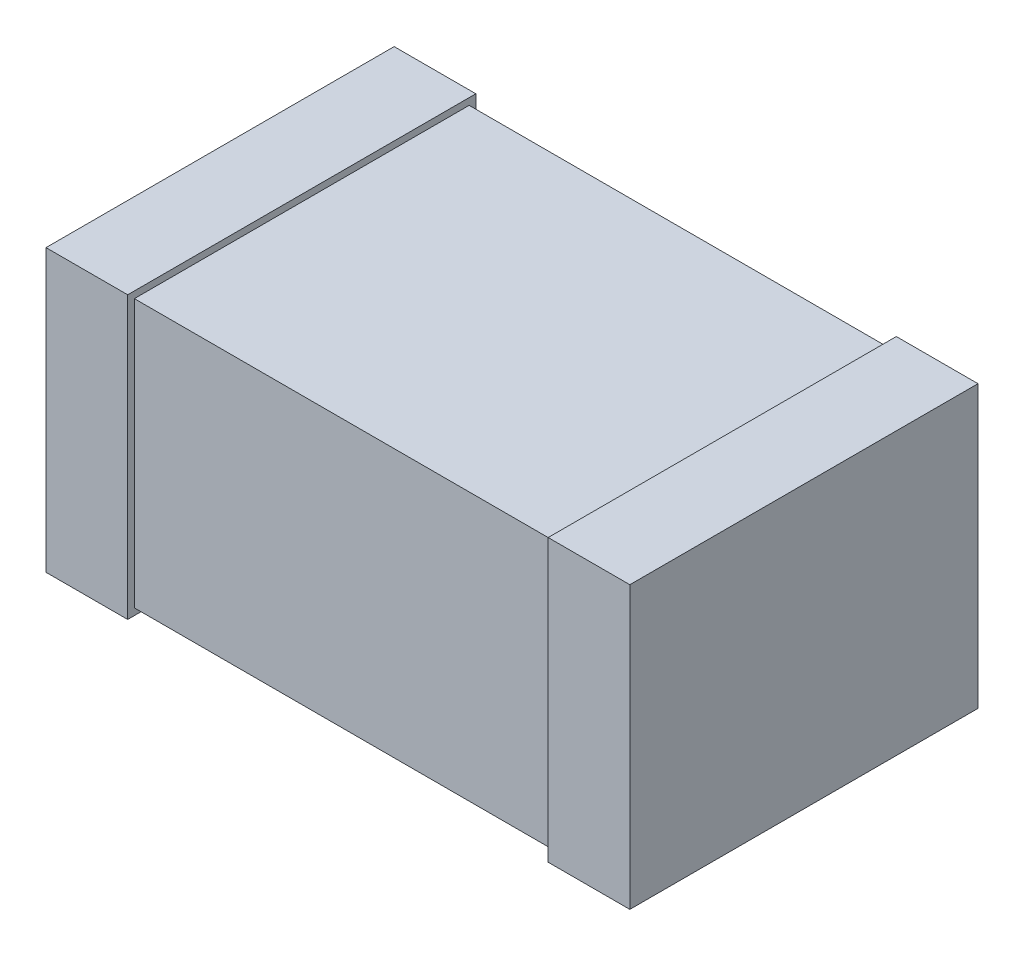
ISO-10303-21;
HEADER;
FILE_DESCRIPTION(('STEP AP214'),'2;1');
FILE_NAME('part.step','',(''),(''),'','','');
FILE_SCHEMA(('AUTOMOTIVE_DESIGN { 1 0 10303 214 1 1 1 1 }'));
ENDSEC;
DATA;
#1=APPLICATION_CONTEXT('core data for automotive mechanical design processes');
#2=APPLICATION_PROTOCOL_DEFINITION('international standard','automotive_design',2000,#1);
#3=PRODUCT_CONTEXT('',#1,'mechanical');
#4=PRODUCT('Part','Part','',(#3));
#5=PRODUCT_RELATED_PRODUCT_CATEGORY('part','',(#4));
#6=PRODUCT_DEFINITION_FORMATION('','',#4);
#7=PRODUCT_DEFINITION_CONTEXT('part definition',#1,'design');
#8=PRODUCT_DEFINITION('design','',#6,#7);
#9=PRODUCT_DEFINITION_SHAPE('','',#8);
#10=(LENGTH_UNIT() NAMED_UNIT(*) SI_UNIT(.MILLI.,.METRE.));
#11=(NAMED_UNIT(*) PLANE_ANGLE_UNIT() SI_UNIT($,.RADIAN.));
#12=(NAMED_UNIT(*) SI_UNIT($,.STERADIAN.) SOLID_ANGLE_UNIT());
#13=UNCERTAINTY_MEASURE_WITH_UNIT(LENGTH_MEASURE(1.E-05),#10,'distance_accuracy_value','');
#14=(GEOMETRIC_REPRESENTATION_CONTEXT(3) GLOBAL_UNCERTAINTY_ASSIGNED_CONTEXT((#13)) GLOBAL_UNIT_ASSIGNED_CONTEXT((#10,
#11,#12)) REPRESENTATION_CONTEXT('',''));
#15=CARTESIAN_POINT('',(0.,0.,0.));
#16=DIRECTION('',(0.,0.,1.));
#17=DIRECTION('',(1.,0.,0.));
#18=AXIS2_PLACEMENT_3D('',#15,#16,#17);
#19=CARTESIAN_POINT('',(-1.6,2.,1.25));
#20=DIRECTION('',(0.,0.,-1.));
#21=DIRECTION('',(-1.,0.,0.));
#22=AXIS2_PLACEMENT_3D('',#19,#20,#21);
#23=PLANE('',#22);
#24=DIRECTION('',(0.,1.,0.));
#25=VECTOR('',#24,1.);
#26=CARTESIAN_POINT('',(-1.57,2.,1.25));
#27=LINE('',#26,#25);
#28=CARTESIAN_POINT('',(-1.57,0.,1.25));
#29=VERTEX_POINT('',#28);
#30=CARTESIAN_POINT('',(-1.57,2.,1.25));
#31=VERTEX_POINT('',#30);
#32=EDGE_CURVE('E171',#29,#31,#27,.T.);
#33=ORIENTED_EDGE('',*,*,#32,.F.);
#34=DIRECTION('',(1.,0.,0.));
#35=VECTOR('',#34,1.);
#36=CARTESIAN_POINT('',(-1.6,0.,1.25));
#37=LINE('',#36,#35);
#38=CARTESIAN_POINT('',(1.57,0.,1.25));
#39=VERTEX_POINT('',#38);
#40=EDGE_CURVE('E215',#29,#39,#37,.T.);
#41=ORIENTED_EDGE('',*,*,#40,.T.);
#42=DIRECTION('',(0.,-1.,0.));
#43=VECTOR('',#42,1.);
#44=CARTESIAN_POINT('',(1.57,2.,1.25));
#45=LINE('',#44,#43);
#46=CARTESIAN_POINT('',(1.57,2.,1.25));
#47=VERTEX_POINT('',#46);
#48=EDGE_CURVE('E210',#47,#39,#45,.T.);
#49=ORIENTED_EDGE('',*,*,#48,.F.);
#50=DIRECTION('',(1.,0.,0.));
#51=VECTOR('',#50,1.);
#52=CARTESIAN_POINT('',(-1.6,2.,1.25));
#53=LINE('',#52,#51);
#54=EDGE_CURVE('E216',#31,#47,#53,.T.);
#55=ORIENTED_EDGE('',*,*,#54,.F.);
#56=EDGE_LOOP('',(#33,#41,#49,#55));
#57=FACE_BOUND('',#56,.T.);
#58=ADVANCED_FACE('F38',(#57),#23,.F.);
#59=CARTESIAN_POINT('',(-1.6,2.,-1.25));
#60=DIRECTION('',(0.,0.,1.));
#61=DIRECTION('',(1.,0.,0.));
#62=AXIS2_PLACEMENT_3D('',#59,#60,#61);
#63=PLANE('',#62);
#64=DIRECTION('',(0.,-1.,0.));
#65=VECTOR('',#64,1.);
#66=CARTESIAN_POINT('',(-1.57,2.,-1.25));
#67=LINE('',#66,#65);
#68=CARTESIAN_POINT('',(-1.57,2.,-1.25));
#69=VERTEX_POINT('',#68);
#70=CARTESIAN_POINT('',(-1.57,0.,-1.25));
#71=VERTEX_POINT('',#70);
#72=EDGE_CURVE('E52',#69,#71,#67,.T.);
#73=ORIENTED_EDGE('',*,*,#72,.F.);
#74=DIRECTION('',(-1.,0.,0.));
#75=VECTOR('',#74,1.);
#76=CARTESIAN_POINT('',(-1.6,2.,-1.25));
#77=LINE('',#76,#75);
#78=CARTESIAN_POINT('',(1.57,2.,-1.25));
#79=VERTEX_POINT('',#78);
#80=EDGE_CURVE('E218',#79,#69,#77,.T.);
#81=ORIENTED_EDGE('',*,*,#80,.F.);
#82=DIRECTION('',(0.,1.,0.));
#83=VECTOR('',#82,1.);
#84=CARTESIAN_POINT('',(1.57,2.,-1.25));
#85=LINE('',#84,#83);
#86=CARTESIAN_POINT('',(1.57,0.,-1.25));
#87=VERTEX_POINT('',#86);
#88=EDGE_CURVE('E202',#87,#79,#85,.T.);
#89=ORIENTED_EDGE('',*,*,#88,.F.);
#90=DIRECTION('',(-1.,0.,0.));
#91=VECTOR('',#90,1.);
#92=CARTESIAN_POINT('',(-1.6,0.,-1.25));
#93=LINE('',#92,#91);
#94=EDGE_CURVE('E219',#87,#71,#93,.T.);
#95=ORIENTED_EDGE('',*,*,#94,.T.);
#96=EDGE_LOOP('',(#73,#81,#89,#95));
#97=FACE_BOUND('',#96,.T.);
#98=ADVANCED_FACE('F233',(#97),#63,.F.);
#99=CARTESIAN_POINT('',(0.,2.,0.));
#100=DIRECTION('',(0.,1.,0.));
#101=DIRECTION('',(0.,0.,1.));
#102=AXIS2_PLACEMENT_3D('',#99,#100,#101);
#103=PLANE('',#102);
#104=ORIENTED_EDGE('',*,*,#80,.T.);
#105=DIRECTION('',(0.,0.,1.));
#106=VECTOR('',#105,1.);
#107=CARTESIAN_POINT('',(-1.57,2.,0.));
#108=LINE('',#107,#106);
#109=EDGE_CURVE('E59',#69,#31,#108,.T.);
#110=ORIENTED_EDGE('',*,*,#109,.T.);
#111=ORIENTED_EDGE('',*,*,#54,.T.);
#112=DIRECTION('',(0.,0.,-1.));
#113=VECTOR('',#112,1.);
#114=CARTESIAN_POINT('',(1.57,2.,0.));
#115=LINE('',#114,#113);
#116=EDGE_CURVE('E213',#47,#79,#115,.T.);
#117=ORIENTED_EDGE('',*,*,#116,.T.);
#118=EDGE_LOOP('',(#104,#110,#111,#117));
#119=FACE_BOUND('',#118,.T.);
#120=ADVANCED_FACE('F234',(#119),#103,.T.);
#121=CARTESIAN_POINT('',(0.,0.,0.));
#122=DIRECTION('',(0.,1.,0.));
#123=DIRECTION('',(0.,0.,1.));
#124=AXIS2_PLACEMENT_3D('',#121,#122,#123);
#125=PLANE('',#124);
#126=DIRECTION('',(0.,0.,1.));
#127=VECTOR('',#126,1.);
#128=CARTESIAN_POINT('',(-1.57,0.,0.));
#129=LINE('',#128,#127);
#130=EDGE_CURVE('E11',#71,#29,#129,.T.);
#131=ORIENTED_EDGE('',*,*,#130,.F.);
#132=ORIENTED_EDGE('',*,*,#94,.F.);
#133=DIRECTION('',(0.,0.,-1.));
#134=VECTOR('',#133,1.);
#135=CARTESIAN_POINT('',(1.57,0.,0.));
#136=LINE('',#135,#134);
#137=EDGE_CURVE('E45',#39,#87,#136,.T.);
#138=ORIENTED_EDGE('',*,*,#137,.F.);
#139=ORIENTED_EDGE('',*,*,#40,.F.);
#140=EDGE_LOOP('',(#131,#132,#138,#139));
#141=FACE_BOUND('',#140,.T.);
#142=ADVANCED_FACE('F231',(#141),#125,.F.);
#143=CARTESIAN_POINT('',(1.57,2.05,1.3));
#144=DIRECTION('',(0.,0.,1.));
#145=DIRECTION('',(1.,0.,0.));
#146=AXIS2_PLACEMENT_3D('',#143,#144,#145);
#147=PLANE('',#146);
#148=DIRECTION('',(1.,0.,0.));
#149=VECTOR('',#148,1.);
#150=CARTESIAN_POINT('',(1.57,-0.0500000000000118,1.3));
#151=LINE('',#150,#149);
#152=CARTESIAN_POINT('',(1.57,-0.0500000000000118,1.3));
#153=VERTEX_POINT('',#152);
#154=CARTESIAN_POINT('',(2.18,-0.0500000000000118,1.3));
#155=VERTEX_POINT('',#154);
#156=EDGE_CURVE('E199',#153,#155,#151,.T.);
#157=ORIENTED_EDGE('',*,*,#156,.T.);
#158=DIRECTION('',(0.,-1.,0.));
#159=VECTOR('',#158,1.);
#160=CARTESIAN_POINT('',(2.18,2.04999999999999,1.3));
#161=LINE('',#160,#159);
#162=CARTESIAN_POINT('',(2.18,2.04999999999999,1.3));
#163=VERTEX_POINT('',#162);
#164=EDGE_CURVE('E175',#163,#155,#161,.T.);
#165=ORIENTED_EDGE('',*,*,#164,.F.);
#166=DIRECTION('',(1.,0.,0.));
#167=VECTOR('',#166,1.);
#168=CARTESIAN_POINT('',(1.57,2.05,1.3));
#169=LINE('',#168,#167);
#170=CARTESIAN_POINT('',(1.57,2.05,1.3));
#171=VERTEX_POINT('',#170);
#172=EDGE_CURVE('E200',#171,#163,#169,.T.);
#173=ORIENTED_EDGE('',*,*,#172,.F.);
#174=DIRECTION('',(0.,-1.,0.));
#175=VECTOR('',#174,1.);
#176=CARTESIAN_POINT('',(1.57,2.05,1.3));
#177=LINE('',#176,#175);
#178=EDGE_CURVE('E187',#171,#153,#177,.T.);
#179=ORIENTED_EDGE('',*,*,#178,.T.);
#180=EDGE_LOOP('',(#157,#165,#173,#179));
#181=FACE_BOUND('',#180,.T.);
#182=ADVANCED_FACE('F249',(#181),#147,.T.);
#183=CARTESIAN_POINT('',(1.57,2.05,-1.3));
#184=DIRECTION('',(0.,1.,0.));
#185=DIRECTION('',(0.,0.,1.));
#186=AXIS2_PLACEMENT_3D('',#183,#184,#185);
#187=PLANE('',#186);
#188=ORIENTED_EDGE('',*,*,#172,.T.);
#189=DIRECTION('',(0.,0.,1.));
#190=VECTOR('',#189,1.);
#191=CARTESIAN_POINT('',(2.18,2.04999999999999,-1.3));
#192=LINE('',#191,#190);
#193=CARTESIAN_POINT('',(2.18,2.04999999999999,-1.3));
#194=VERTEX_POINT('',#193);
#195=EDGE_CURVE('E184',#194,#163,#192,.T.);
#196=ORIENTED_EDGE('',*,*,#195,.F.);
#197=DIRECTION('',(1.,0.,0.));
#198=VECTOR('',#197,1.);
#199=CARTESIAN_POINT('',(1.57,2.05,-1.3));
#200=LINE('',#199,#198);
#201=CARTESIAN_POINT('',(1.57,2.05,-1.3));
#202=VERTEX_POINT('',#201);
#203=EDGE_CURVE('E203',#202,#194,#200,.T.);
#204=ORIENTED_EDGE('',*,*,#203,.F.);
#205=DIRECTION('',(0.,0.,1.));
#206=VECTOR('',#205,1.);
#207=CARTESIAN_POINT('',(1.57,2.05,-1.3));
#208=LINE('',#207,#206);
#209=EDGE_CURVE('E196',#202,#171,#208,.T.);
#210=ORIENTED_EDGE('',*,*,#209,.T.);
#211=EDGE_LOOP('',(#188,#196,#204,#210));
#212=FACE_BOUND('',#211,.T.);
#213=ADVANCED_FACE('F253',(#212),#187,.T.);
#214=CARTESIAN_POINT('',(1.57,-0.0500000000000118,-1.3));
#215=DIRECTION('',(0.,0.,-1.));
#216=DIRECTION('',(-1.,0.,0.));
#217=AXIS2_PLACEMENT_3D('',#214,#215,#216);
#218=PLANE('',#217);
#219=ORIENTED_EDGE('',*,*,#203,.T.);
#220=DIRECTION('',(0.,1.,0.));
#221=VECTOR('',#220,1.);
#222=CARTESIAN_POINT('',(2.18,-0.0500000000000118,-1.3));
#223=LINE('',#222,#221);
#224=CARTESIAN_POINT('',(2.18,-0.0500000000000118,-1.3));
#225=VERTEX_POINT('',#224);
#226=EDGE_CURVE('E181',#225,#194,#223,.T.);
#227=ORIENTED_EDGE('',*,*,#226,.F.);
#228=DIRECTION('',(1.,0.,0.));
#229=VECTOR('',#228,1.);
#230=CARTESIAN_POINT('',(1.57,-0.0500000000000118,-1.3));
#231=LINE('',#230,#229);
#232=CARTESIAN_POINT('',(1.57,-0.0500000000000118,-1.3));
#233=VERTEX_POINT('',#232);
#234=EDGE_CURVE('E205',#233,#225,#231,.T.);
#235=ORIENTED_EDGE('',*,*,#234,.F.);
#236=DIRECTION('',(0.,1.,0.));
#237=VECTOR('',#236,1.);
#238=CARTESIAN_POINT('',(1.57,-0.0500000000000118,-1.3));
#239=LINE('',#238,#237);
#240=EDGE_CURVE('E193',#233,#202,#239,.T.);
#241=ORIENTED_EDGE('',*,*,#240,.T.);
#242=EDGE_LOOP('',(#219,#227,#235,#241));
#243=FACE_BOUND('',#242,.T.);
#244=ADVANCED_FACE('F258',(#243),#218,.T.);
#245=CARTESIAN_POINT('',(1.57,-0.0500000000000118,1.3));
#246=DIRECTION('',(0.,-1.,0.));
#247=DIRECTION('',(0.,0.,-1.));
#248=AXIS2_PLACEMENT_3D('',#245,#246,#247);
#249=PLANE('',#248);
#250=ORIENTED_EDGE('',*,*,#234,.T.);
#251=DIRECTION('',(0.,0.,-1.));
#252=VECTOR('',#251,1.);
#253=CARTESIAN_POINT('',(2.18,-0.0500000000000118,1.3));
#254=LINE('',#253,#252);
#255=EDGE_CURVE('E178',#155,#225,#254,.T.);
#256=ORIENTED_EDGE('',*,*,#255,.F.);
#257=ORIENTED_EDGE('',*,*,#156,.F.);
#258=DIRECTION('',(0.,0.,-1.));
#259=VECTOR('',#258,1.);
#260=CARTESIAN_POINT('',(1.57,-0.0500000000000118,1.3));
#261=LINE('',#260,#259);
#262=EDGE_CURVE('E190',#153,#233,#261,.T.);
#263=ORIENTED_EDGE('',*,*,#262,.T.);
#264=EDGE_LOOP('',(#250,#256,#257,#263));
#265=FACE_BOUND('',#264,.T.);
#266=ADVANCED_FACE('F255',(#265),#249,.T.);
#267=CARTESIAN_POINT('',(1.57,0.,0.));
#268=DIRECTION('',(1.,0.,0.));
#269=DIRECTION('',(0.,0.,-1.));
#270=AXIS2_PLACEMENT_3D('',#267,#268,#269);
#271=PLANE('',#270);
#272=ORIENTED_EDGE('',*,*,#116,.F.);
#273=ORIENTED_EDGE('',*,*,#48,.T.);
#274=ORIENTED_EDGE('',*,*,#137,.T.);
#275=ORIENTED_EDGE('',*,*,#88,.T.);
#276=EDGE_LOOP('',(#272,#273,#274,#275));
#277=FACE_BOUND('',#276,.T.);
#278=ORIENTED_EDGE('',*,*,#178,.F.);
#279=ORIENTED_EDGE('',*,*,#209,.F.);
#280=ORIENTED_EDGE('',*,*,#240,.F.);
#281=ORIENTED_EDGE('',*,*,#262,.F.);
#282=EDGE_LOOP('',(#278,#279,#280,#281));
#283=FACE_BOUND('',#282,.T.);
#284=ADVANCED_FACE('F226',(#277,#283),#271,.F.);
#285=CARTESIAN_POINT('',(2.18,0.,0.));
#286=DIRECTION('',(1.,0.,0.));
#287=DIRECTION('',(0.,0.,-1.));
#288=AXIS2_PLACEMENT_3D('',#285,#286,#287);
#289=PLANE('',#288);
#290=ORIENTED_EDGE('',*,*,#164,.T.);
#291=ORIENTED_EDGE('',*,*,#255,.T.);
#292=ORIENTED_EDGE('',*,*,#226,.T.);
#293=ORIENTED_EDGE('',*,*,#195,.T.);
#294=EDGE_LOOP('',(#290,#291,#292,#293));
#295=FACE_BOUND('',#294,.T.);
#296=ADVANCED_FACE('F268',(#295),#289,.T.);
#297=CARTESIAN_POINT('',(-1.57,2.05,1.3));
#298=DIRECTION('',(0.,0.,-1.));
#299=DIRECTION('',(-1.,0.,0.));
#300=AXIS2_PLACEMENT_3D('',#297,#298,#299);
#301=PLANE('',#300);
#302=DIRECTION('',(-1.,0.,0.));
#303=VECTOR('',#302,1.);
#304=CARTESIAN_POINT('',(-1.57,2.05,1.3));
#305=LINE('',#304,#303);
#306=CARTESIAN_POINT('',(-1.57,2.05,1.3));
#307=VERTEX_POINT('',#306);
#308=CARTESIAN_POINT('',(-2.18,2.05,1.3));
#309=VERTEX_POINT('',#308);
#310=EDGE_CURVE('E129',#307,#309,#305,.T.);
#311=ORIENTED_EDGE('',*,*,#310,.T.);
#312=DIRECTION('',(0.,-1.,0.));
#313=VECTOR('',#312,1.);
#314=CARTESIAN_POINT('',(-2.18,2.05,1.3));
#315=LINE('',#314,#313);
#316=CARTESIAN_POINT('',(-2.18,-0.0500000000000014,1.3));
#317=VERTEX_POINT('',#316);
#318=EDGE_CURVE('E133',#309,#317,#315,.T.);
#319=ORIENTED_EDGE('',*,*,#318,.T.);
#320=DIRECTION('',(-1.,0.,0.));
#321=VECTOR('',#320,1.);
#322=CARTESIAN_POINT('',(-1.57,-0.0500000000000014,1.3));
#323=LINE('',#322,#321);
#324=CARTESIAN_POINT('',(-1.57,-0.0500000000000014,1.3));
#325=VERTEX_POINT('',#324);
#326=EDGE_CURVE('E165',#325,#317,#323,.T.);
#327=ORIENTED_EDGE('',*,*,#326,.F.);
#328=DIRECTION('',(0.,-1.,0.));
#329=VECTOR('',#328,1.);
#330=CARTESIAN_POINT('',(-1.57,2.05,1.3));
#331=LINE('',#330,#329);
#332=EDGE_CURVE('E136',#307,#325,#331,.T.);
#333=ORIENTED_EDGE('',*,*,#332,.F.);
#334=EDGE_LOOP('',(#311,#319,#327,#333));
#335=FACE_BOUND('',#334,.T.);
#336=ADVANCED_FACE('F131',(#335),#301,.F.);
#337=CARTESIAN_POINT('',(-1.57,-0.0500000000000014,1.3));
#338=DIRECTION('',(0.,1.,0.));
#339=DIRECTION('',(0.,0.,1.));
#340=AXIS2_PLACEMENT_3D('',#337,#338,#339);
#341=PLANE('',#340);
#342=ORIENTED_EDGE('',*,*,#326,.T.);
#343=DIRECTION('',(0.,0.,-1.));
#344=VECTOR('',#343,1.);
#345=CARTESIAN_POINT('',(-2.18,-0.0500000000000014,1.3));
#346=LINE('',#345,#344);
#347=CARTESIAN_POINT('',(-2.18,-0.0500000000000014,-1.3));
#348=VERTEX_POINT('',#347);
#349=EDGE_CURVE('E150',#317,#348,#346,.T.);
#350=ORIENTED_EDGE('',*,*,#349,.T.);
#351=DIRECTION('',(-1.,0.,0.));
#352=VECTOR('',#351,1.);
#353=CARTESIAN_POINT('',(-1.57,-0.0500000000000014,-1.3));
#354=LINE('',#353,#352);
#355=CARTESIAN_POINT('',(-1.57,-0.0500000000000014,-1.3));
#356=VERTEX_POINT('',#355);
#357=EDGE_CURVE('E167',#356,#348,#354,.T.);
#358=ORIENTED_EDGE('',*,*,#357,.F.);
#359=DIRECTION('',(0.,0.,-1.));
#360=VECTOR('',#359,1.);
#361=CARTESIAN_POINT('',(-1.57,-0.0500000000000014,1.3));
#362=LINE('',#361,#360);
#363=EDGE_CURVE('E141',#325,#356,#362,.T.);
#364=ORIENTED_EDGE('',*,*,#363,.F.);
#365=EDGE_LOOP('',(#342,#350,#358,#364));
#366=FACE_BOUND('',#365,.T.);
#367=ADVANCED_FACE('F274',(#366),#341,.F.);
#368=CARTESIAN_POINT('',(-1.57,-0.0500000000000014,-1.3));
#369=DIRECTION('',(0.,0.,1.));
#370=DIRECTION('',(1.,0.,0.));
#371=AXIS2_PLACEMENT_3D('',#368,#369,#370);
#372=PLANE('',#371);
#373=ORIENTED_EDGE('',*,*,#357,.T.);
#374=DIRECTION('',(0.,1.,0.));
#375=VECTOR('',#374,1.);
#376=CARTESIAN_POINT('',(-2.18,-0.0500000000000014,-1.3));
#377=LINE('',#376,#375);
#378=CARTESIAN_POINT('',(-2.18,2.05,-1.3));
#379=VERTEX_POINT('',#378);
#380=EDGE_CURVE('E154',#348,#379,#377,.T.);
#381=ORIENTED_EDGE('',*,*,#380,.T.);
#382=DIRECTION('',(-1.,0.,0.));
#383=VECTOR('',#382,1.);
#384=CARTESIAN_POINT('',(-1.57,2.05,-1.3));
#385=LINE('',#384,#383);
#386=CARTESIAN_POINT('',(-1.57,2.05,-1.3));
#387=VERTEX_POINT('',#386);
#388=EDGE_CURVE('E140',#387,#379,#385,.T.);
#389=ORIENTED_EDGE('',*,*,#388,.F.);
#390=DIRECTION('',(0.,1.,0.));
#391=VECTOR('',#390,1.);
#392=CARTESIAN_POINT('',(-1.57,-0.0500000000000014,-1.3));
#393=LINE('',#392,#391);
#394=EDGE_CURVE('E162',#356,#387,#393,.T.);
#395=ORIENTED_EDGE('',*,*,#394,.F.);
#396=EDGE_LOOP('',(#373,#381,#389,#395));
#397=FACE_BOUND('',#396,.T.);
#398=ADVANCED_FACE('F277',(#397),#372,.F.);
#399=CARTESIAN_POINT('',(-1.57,2.05,-1.3));
#400=DIRECTION('',(0.,-1.,0.));
#401=DIRECTION('',(0.,0.,-1.));
#402=AXIS2_PLACEMENT_3D('',#399,#400,#401);
#403=PLANE('',#402);
#404=ORIENTED_EDGE('',*,*,#388,.T.);
#405=DIRECTION('',(0.,0.,1.));
#406=VECTOR('',#405,1.);
#407=CARTESIAN_POINT('',(-2.18,2.05,-1.3));
#408=LINE('',#407,#406);
#409=EDGE_CURVE('E147',#379,#309,#408,.T.);
#410=ORIENTED_EDGE('',*,*,#409,.T.);
#411=ORIENTED_EDGE('',*,*,#310,.F.);
#412=DIRECTION('',(0.,0.,1.));
#413=VECTOR('',#412,1.);
#414=CARTESIAN_POINT('',(-1.57,2.05,-1.3));
#415=LINE('',#414,#413);
#416=EDGE_CURVE('E160',#387,#307,#415,.T.);
#417=ORIENTED_EDGE('',*,*,#416,.F.);
#418=EDGE_LOOP('',(#404,#410,#411,#417));
#419=FACE_BOUND('',#418,.T.);
#420=ADVANCED_FACE('F152',(#419),#403,.F.);
#421=CARTESIAN_POINT('',(-1.57,0.,0.));
#422=DIRECTION('',(-1.,0.,0.));
#423=DIRECTION('',(0.,0.,-1.));
#424=AXIS2_PLACEMENT_3D('',#421,#422,#423);
#425=PLANE('',#424);
#426=ORIENTED_EDGE('',*,*,#109,.F.);
#427=ORIENTED_EDGE('',*,*,#72,.T.);
#428=ORIENTED_EDGE('',*,*,#130,.T.);
#429=ORIENTED_EDGE('',*,*,#32,.T.);
#430=EDGE_LOOP('',(#426,#427,#428,#429));
#431=FACE_BOUND('',#430,.T.);
#432=ORIENTED_EDGE('',*,*,#332,.T.);
#433=ORIENTED_EDGE('',*,*,#363,.T.);
#434=ORIENTED_EDGE('',*,*,#394,.T.);
#435=ORIENTED_EDGE('',*,*,#416,.T.);
#436=EDGE_LOOP('',(#432,#433,#434,#435));
#437=FACE_BOUND('',#436,.T.);
#438=ADVANCED_FACE('F236',(#431,#437),#425,.F.);
#439=CARTESIAN_POINT('',(-2.18,0.,0.));
#440=DIRECTION('',(-1.,0.,0.));
#441=DIRECTION('',(0.,0.,-1.));
#442=AXIS2_PLACEMENT_3D('',#439,#440,#441);
#443=PLANE('',#442);
#444=ORIENTED_EDGE('',*,*,#318,.F.);
#445=ORIENTED_EDGE('',*,*,#409,.F.);
#446=ORIENTED_EDGE('',*,*,#380,.F.);
#447=ORIENTED_EDGE('',*,*,#349,.F.);
#448=EDGE_LOOP('',(#444,#445,#446,#447));
#449=FACE_BOUND('',#448,.T.);
#450=ADVANCED_FACE('F145',(#449),#443,.T.);
#451=CLOSED_SHELL('',(#58,#98,#120,#142,#182,#213,#244,#266,#284,#296,#336,#367,#398,#420,#438,#450));
#452=MANIFOLD_SOLID_BREP('B2',#451);
#453=ADVANCED_BREP_SHAPE_REPRESENTATION('',(#18,#452),#14);
#454=SHAPE_DEFINITION_REPRESENTATION(#9,#453);
ENDSEC;
END-ISO-10303-21;
